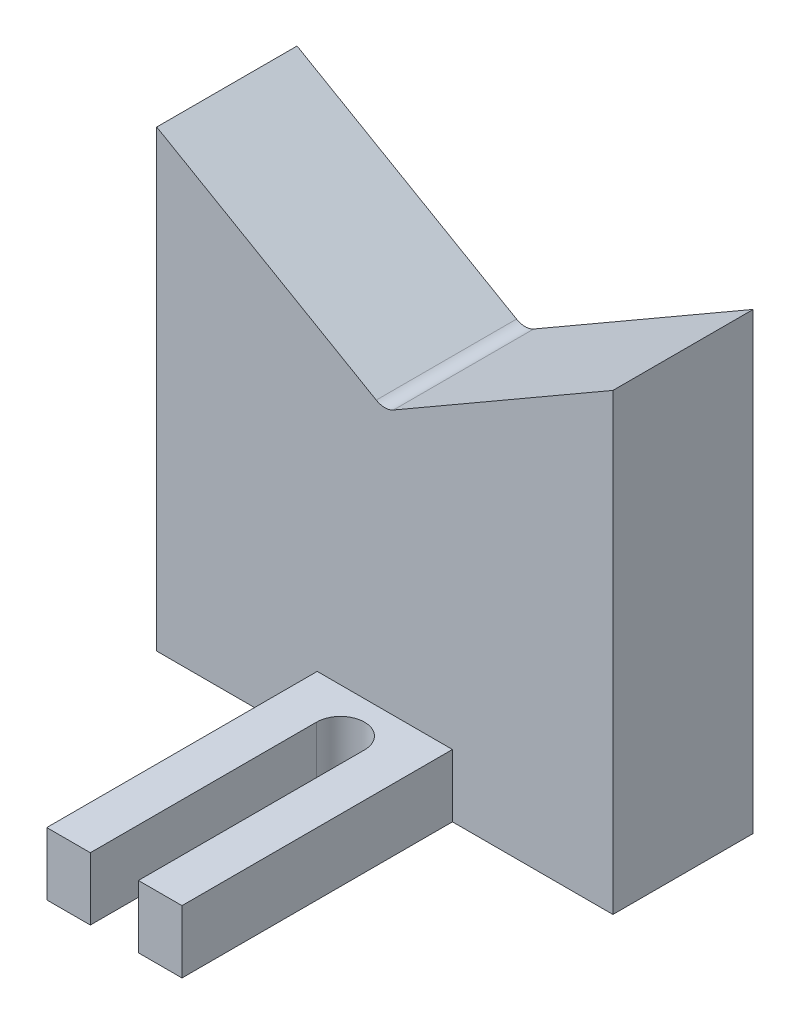
ISO-10303-21;
HEADER;
FILE_DESCRIPTION(('STEP AP214'),'2;1');
FILE_NAME('part.step','',(''),(''),'','','');
FILE_SCHEMA(('AUTOMOTIVE_DESIGN { 1 0 10303 214 1 1 1 1 }'));
ENDSEC;
DATA;
#1=APPLICATION_CONTEXT('core data for automotive mechanical design processes');
#2=APPLICATION_PROTOCOL_DEFINITION('international standard','automotive_design',2000,#1);
#3=PRODUCT_CONTEXT('',#1,'mechanical');
#4=PRODUCT('Part','Part','',(#3));
#5=PRODUCT_RELATED_PRODUCT_CATEGORY('part','',(#4));
#6=PRODUCT_DEFINITION_FORMATION('','',#4);
#7=PRODUCT_DEFINITION_CONTEXT('part definition',#1,'design');
#8=PRODUCT_DEFINITION('design','',#6,#7);
#9=PRODUCT_DEFINITION_SHAPE('','',#8);
#10=(LENGTH_UNIT() NAMED_UNIT(*) SI_UNIT(.MILLI.,.METRE.));
#11=(NAMED_UNIT(*) PLANE_ANGLE_UNIT() SI_UNIT($,.RADIAN.));
#12=(NAMED_UNIT(*) SI_UNIT($,.STERADIAN.) SOLID_ANGLE_UNIT());
#13=UNCERTAINTY_MEASURE_WITH_UNIT(LENGTH_MEASURE(1.E-05),#10,'distance_accuracy_value','');
#14=(GEOMETRIC_REPRESENTATION_CONTEXT(3) GLOBAL_UNCERTAINTY_ASSIGNED_CONTEXT((#13)) GLOBAL_UNIT_ASSIGNED_CONTEXT((#10,
#11,#12)) REPRESENTATION_CONTEXT('',''));
#15=CARTESIAN_POINT('',(0.,0.,0.));
#16=DIRECTION('',(0.,0.,1.));
#17=DIRECTION('',(1.,0.,0.));
#18=AXIS2_PLACEMENT_3D('',#15,#16,#17);
#19=CARTESIAN_POINT('',(-10.,-38.3824746458796,60.7518));
#20=DIRECTION('',(0.,0.,1.));
#21=DIRECTION('',(1.,0.,0.));
#22=AXIS2_PLACEMENT_3D('',#19,#20,#21);
#23=PLANE('',#22);
#24=DIRECTION('',(1.,0.,0.));
#25=VECTOR('',#24,1.);
#26=CARTESIAN_POINT('',(-10.,-47.6524746458796,60.7518));
#27=LINE('',#26,#25);
#28=CARTESIAN_POINT('',(-10.,-47.6524746458796,60.7518));
#29=VERTEX_POINT('',#28);
#30=CARTESIAN_POINT('',(-3.55499999999999,-47.6524746458796,60.7518));
#31=VERTEX_POINT('',#30);
#32=EDGE_CURVE('E163',#29,#31,#27,.T.);
#33=ORIENTED_EDGE('',*,*,#32,.T.);
#34=DIRECTION('',(0.,1.,0.));
#35=VECTOR('',#34,1.);
#36=CARTESIAN_POINT('',(-3.55499999999999,-48.3824746458796,60.7518));
#37=LINE('',#36,#35);
#38=CARTESIAN_POINT('',(-3.55499999999999,-38.3824746458796,60.7518));
#39=VERTEX_POINT('',#38);
#40=EDGE_CURVE('E150',#31,#39,#37,.T.);
#41=ORIENTED_EDGE('',*,*,#40,.T.);
#42=DIRECTION('',(1.,0.,0.));
#43=VECTOR('',#42,1.);
#44=CARTESIAN_POINT('',(-10.,-38.3824746458796,60.7518));
#45=LINE('',#44,#43);
#46=CARTESIAN_POINT('',(-10.,-38.3824746458796,60.7518));
#47=VERTEX_POINT('',#46);
#48=EDGE_CURVE('E156',#47,#39,#45,.T.);
#49=ORIENTED_EDGE('',*,*,#48,.F.);
#50=DIRECTION('',(0.,-1.,0.));
#51=VECTOR('',#50,1.);
#52=CARTESIAN_POINT('',(-10.,-38.3824746458796,60.7518));
#53=LINE('',#52,#51);
#54=EDGE_CURVE('E242',#47,#29,#53,.T.);
#55=ORIENTED_EDGE('',*,*,#54,.T.);
#56=EDGE_LOOP('',(#33,#41,#49,#55));
#57=FACE_BOUND('',#56,.T.);
#58=ADVANCED_FACE('F41',(#57),#23,.T.);
#59=CARTESIAN_POINT('',(-10.,-38.3824746458796,60.7518));
#60=DIRECTION('',(0.,1.,0.));
#61=DIRECTION('',(0.,0.,1.));
#62=AXIS2_PLACEMENT_3D('',#59,#60,#61);
#63=PLANE('',#62);
#64=CARTESIAN_POINT('',(0.,-38.3824746458796,27.3068));
#65=DIRECTION('',(0.,1.,0.));
#66=DIRECTION('',(0.,0.,1.));
#67=AXIS2_PLACEMENT_3D('',#64,#65,#66);
#68=CIRCLE('',#67,3.55500000000001);
#69=CARTESIAN_POINT('',(3.55500000000002,-38.3824746458796,27.3068));
#70=VERTEX_POINT('',#69);
#71=CARTESIAN_POINT('',(-3.555,-38.3824746458796,27.3068));
#72=VERTEX_POINT('',#71);
#73=EDGE_CURVE('E155',#70,#72,#68,.T.);
#74=ORIENTED_EDGE('',*,*,#73,.F.);
#75=DIRECTION('',(0.,0.,1.));
#76=VECTOR('',#75,1.);
#77=CARTESIAN_POINT('',(3.55500000000001,-38.3824746458796,60.7518));
#78=LINE('',#77,#76);
#79=CARTESIAN_POINT('',(3.55500000000001,-38.3824746458796,60.7518));
#80=VERTEX_POINT('',#79);
#81=EDGE_CURVE('E57',#70,#80,#78,.T.);
#82=ORIENTED_EDGE('',*,*,#81,.T.);
#83=CARTESIAN_POINT('',(10.,-38.3824746458796,60.7518));
#84=VERTEX_POINT('',#83);
#85=EDGE_CURVE('E169',#80,#84,#45,.T.);
#86=ORIENTED_EDGE('',*,*,#85,.T.);
#87=DIRECTION('',(0.,0.,1.));
#88=VECTOR('',#87,1.);
#89=CARTESIAN_POINT('',(10.,-38.3824746458796,60.7518));
#90=LINE('',#89,#88);
#91=CARTESIAN_POINT('',(10.,-38.3824746458796,20.7518));
#92=VERTEX_POINT('',#91);
#93=EDGE_CURVE('E247',#92,#84,#90,.T.);
#94=ORIENTED_EDGE('',*,*,#93,.F.);
#95=DIRECTION('',(1.,0.,0.));
#96=VECTOR('',#95,1.);
#97=CARTESIAN_POINT('',(-10.,-38.3824746458796,20.7518));
#98=LINE('',#97,#96);
#99=CARTESIAN_POINT('',(-10.,-38.3824746458796,20.7518));
#100=VERTEX_POINT('',#99);
#101=EDGE_CURVE('E172',#100,#92,#98,.T.);
#102=ORIENTED_EDGE('',*,*,#101,.F.);
#103=DIRECTION('',(0.,0.,1.));
#104=VECTOR('',#103,1.);
#105=CARTESIAN_POINT('',(-10.,-38.3824746458796,60.7518));
#106=LINE('',#105,#104);
#107=EDGE_CURVE('E170',#100,#47,#106,.T.);
#108=ORIENTED_EDGE('',*,*,#107,.T.);
#109=ORIENTED_EDGE('',*,*,#48,.T.);
#110=DIRECTION('',(0.,0.,1.));
#111=VECTOR('',#110,1.);
#112=CARTESIAN_POINT('',(-3.55499999999999,-38.3824746458796,60.7518));
#113=LINE('',#112,#111);
#114=EDGE_CURVE('E144',#72,#39,#113,.T.);
#115=ORIENTED_EDGE('',*,*,#114,.F.);
#116=EDGE_LOOP('',(#74,#82,#86,#94,#102,#108,#109,#115));
#117=FACE_BOUND('',#116,.T.);
#118=ADVANCED_FACE('F164',(#117),#63,.T.);
#119=CARTESIAN_POINT('',(0.,0.,20.7518));
#120=DIRECTION('',(0.,0.,-1.));
#121=DIRECTION('',(-1.,0.,0.));
#122=AXIS2_PLACEMENT_3D('',#119,#120,#121);
#123=PLANE('',#122);
#124=DIRECTION('',(0.,1.,0.));
#125=VECTOR('',#124,1.);
#126=CARTESIAN_POINT('',(10.,-38.3824746458796,20.7518));
#127=LINE('',#126,#125);
#128=CARTESIAN_POINT('',(10.,-47.6524746458796,20.7518));
#129=VERTEX_POINT('',#128);
#130=EDGE_CURVE('E252',#129,#92,#127,.T.);
#131=ORIENTED_EDGE('',*,*,#130,.F.);
#132=DIRECTION('',(1.,0.,0.));
#133=VECTOR('',#132,1.);
#134=CARTESIAN_POINT('',(-33.735,-47.6524746458796,20.7518));
#135=LINE('',#134,#133);
#136=CARTESIAN_POINT('',(33.735,-47.6524746458796,20.7518));
#137=VERTEX_POINT('',#136);
#138=EDGE_CURVE('E184',#129,#137,#135,.T.);
#139=ORIENTED_EDGE('',*,*,#138,.T.);
#140=DIRECTION('',(0.,1.,0.));
#141=VECTOR('',#140,1.);
#142=CARTESIAN_POINT('',(33.735,-47.6524746458796,20.7518));
#143=LINE('',#142,#141);
#144=CARTESIAN_POINT('',(33.735,19.4769113311123,20.7518));
#145=VERTEX_POINT('',#144);
#146=EDGE_CURVE('E188',#137,#145,#143,.T.);
#147=ORIENTED_EDGE('',*,*,#146,.T.);
#148=DIRECTION('',(-0.866025403784436,-0.500000000000005,0.));
#149=VECTOR('',#148,1.);
#150=CARTESIAN_POINT('',(33.735,19.4769113311123,20.7518));
#151=LINE('',#150,#149);
#152=CARTESIAN_POINT('',(1.27,0.733234841870833,20.7518));
#153=VERTEX_POINT('',#152);
#154=EDGE_CURVE('E195',#145,#153,#151,.T.);
#155=ORIENTED_EDGE('',*,*,#154,.T.);
#156=CARTESIAN_POINT('',(0.,2.93293936748331,20.7518));
#157=DIRECTION('',(0.,0.,-1.));
#158=DIRECTION('',(-1.,0.,0.));
#159=AXIS2_PLACEMENT_3D('',#156,#157,#158);
#160=CIRCLE('',#159,2.54);
#161=CARTESIAN_POINT('',(-1.27000000000001,0.73323484187084,20.7518));
#162=VERTEX_POINT('',#161);
#163=EDGE_CURVE('E216',#153,#162,#160,.T.);
#164=ORIENTED_EDGE('',*,*,#163,.T.);
#165=DIRECTION('',(-0.866025403784436,0.500000000000004,0.));
#166=VECTOR('',#165,1.);
#167=CARTESIAN_POINT('',(-33.735,19.4769113311123,20.7518));
#168=LINE('',#167,#166);
#169=CARTESIAN_POINT('',(-33.735,19.4769113311123,20.7518));
#170=VERTEX_POINT('',#169);
#171=EDGE_CURVE('E193',#162,#170,#168,.T.);
#172=ORIENTED_EDGE('',*,*,#171,.T.);
#173=DIRECTION('',(0.,-1.,0.));
#174=VECTOR('',#173,1.);
#175=CARTESIAN_POINT('',(-33.735,-47.6524746458796,20.7518));
#176=LINE('',#175,#174);
#177=CARTESIAN_POINT('',(-33.735,-47.6524746458796,20.7518));
#178=VERTEX_POINT('',#177);
#179=EDGE_CURVE('E185',#170,#178,#176,.T.);
#180=ORIENTED_EDGE('',*,*,#179,.T.);
#181=CARTESIAN_POINT('',(-10.,-47.6524746458796,20.7518));
#182=VERTEX_POINT('',#181);
#183=EDGE_CURVE('E190',#178,#182,#135,.T.);
#184=ORIENTED_EDGE('',*,*,#183,.T.);
#185=DIRECTION('',(0.,1.,0.));
#186=VECTOR('',#185,1.);
#187=CARTESIAN_POINT('',(-10.,-38.3824746458796,20.7518));
#188=LINE('',#187,#186);
#189=EDGE_CURVE('E237',#182,#100,#188,.T.);
#190=ORIENTED_EDGE('',*,*,#189,.T.);
#191=ORIENTED_EDGE('',*,*,#101,.T.);
#192=EDGE_LOOP('',(#131,#139,#147,#155,#164,#172,#180,#184,#190,#191));
#193=FACE_BOUND('',#192,.T.);
#194=ADVANCED_FACE('F267',(#193),#123,.F.);
#195=CARTESIAN_POINT('',(-33.735,-47.6524746458796,20.7518));
#196=DIRECTION('',(1.,0.,0.));
#197=DIRECTION('',(0.,0.,-1.));
#198=AXIS2_PLACEMENT_3D('',#195,#196,#197);
#199=PLANE('',#198);
#200=DIRECTION('',(0.,-1.,0.));
#201=VECTOR('',#200,1.);
#202=CARTESIAN_POINT('',(-33.735,-47.6524746458796,0.));
#203=LINE('',#202,#201);
#204=CARTESIAN_POINT('',(-33.735,19.4769113311123,0.));
#205=VERTEX_POINT('',#204);
#206=CARTESIAN_POINT('',(-33.735,-47.6524746458796,0.));
#207=VERTEX_POINT('',#206);
#208=EDGE_CURVE('E166',#205,#207,#203,.T.);
#209=ORIENTED_EDGE('',*,*,#208,.T.);
#210=DIRECTION('',(0.,0.,-1.));
#211=VECTOR('',#210,1.);
#212=CARTESIAN_POINT('',(-33.735,-47.6524746458796,20.7518));
#213=LINE('',#212,#211);
#214=EDGE_CURVE('E211',#178,#207,#213,.T.);
#215=ORIENTED_EDGE('',*,*,#214,.F.);
#216=ORIENTED_EDGE('',*,*,#179,.F.);
#217=DIRECTION('',(0.,0.,-1.));
#218=VECTOR('',#217,1.);
#219=CARTESIAN_POINT('',(-33.735,19.4769113311123,20.7518));
#220=LINE('',#219,#218);
#221=EDGE_CURVE('E194',#170,#205,#220,.T.);
#222=ORIENTED_EDGE('',*,*,#221,.T.);
#223=EDGE_LOOP('',(#209,#215,#216,#222));
#224=FACE_BOUND('',#223,.T.);
#225=ADVANCED_FACE('F290',(#224),#199,.F.);
#226=CARTESIAN_POINT('',(-33.735,-47.6524746458796,20.7518));
#227=DIRECTION('',(0.,1.,0.));
#228=DIRECTION('',(0.,0.,1.));
#229=AXIS2_PLACEMENT_3D('',#226,#227,#228);
#230=PLANE('',#229);
#231=CARTESIAN_POINT('',(0.,-47.6524746458796,27.3068));
#232=DIRECTION('',(0.,1.,0.));
#233=DIRECTION('',(0.,0.,1.));
#234=AXIS2_PLACEMENT_3D('',#231,#232,#233);
#235=CIRCLE('',#234,3.55500000000001);
#236=CARTESIAN_POINT('',(3.55500000000001,-47.6524746458796,27.3068));
#237=VERTEX_POINT('',#236);
#238=CARTESIAN_POINT('',(-3.555,-47.6524746458796,27.3068));
#239=VERTEX_POINT('',#238);
#240=EDGE_CURVE('E162',#237,#239,#235,.T.);
#241=ORIENTED_EDGE('',*,*,#240,.T.);
#242=DIRECTION('',(0.,0.,1.));
#243=VECTOR('',#242,1.);
#244=CARTESIAN_POINT('',(-3.555,-47.6524746458796,20.7518));
#245=LINE('',#244,#243);
#246=EDGE_CURVE('E11',#239,#31,#245,.T.);
#247=ORIENTED_EDGE('',*,*,#246,.T.);
#248=ORIENTED_EDGE('',*,*,#32,.F.);
#249=DIRECTION('',(0.,0.,-1.));
#250=VECTOR('',#249,1.);
#251=CARTESIAN_POINT('',(-10.,-47.6524746458796,60.7518));
#252=LINE('',#251,#250);
#253=EDGE_CURVE('E241',#29,#182,#252,.T.);
#254=ORIENTED_EDGE('',*,*,#253,.T.);
#255=ORIENTED_EDGE('',*,*,#183,.F.);
#256=ORIENTED_EDGE('',*,*,#214,.T.);
#257=DIRECTION('',(1.,0.,0.));
#258=VECTOR('',#257,1.);
#259=CARTESIAN_POINT('',(-33.735,-47.6524746458796,0.));
#260=LINE('',#259,#258);
#261=CARTESIAN_POINT('',(33.735,-47.6524746458796,0.));
#262=VERTEX_POINT('',#261);
#263=EDGE_CURVE('E175',#207,#262,#260,.T.);
#264=ORIENTED_EDGE('',*,*,#263,.T.);
#265=DIRECTION('',(0.,0.,-1.));
#266=VECTOR('',#265,1.);
#267=CARTESIAN_POINT('',(33.735,-47.6524746458796,20.7518));
#268=LINE('',#267,#266);
#269=EDGE_CURVE('E206',#137,#262,#268,.T.);
#270=ORIENTED_EDGE('',*,*,#269,.F.);
#271=ORIENTED_EDGE('',*,*,#138,.F.);
#272=DIRECTION('',(0.,0.,-1.));
#273=VECTOR('',#272,1.);
#274=CARTESIAN_POINT('',(10.,-47.6524746458796,60.7518));
#275=LINE('',#274,#273);
#276=CARTESIAN_POINT('',(10.,-47.6524746458796,60.7518));
#277=VERTEX_POINT('',#276);
#278=EDGE_CURVE('E240',#277,#129,#275,.T.);
#279=ORIENTED_EDGE('',*,*,#278,.F.);
#280=CARTESIAN_POINT('',(3.55500000000001,-47.6524746458796,60.7518));
#281=VERTEX_POINT('',#280);
#282=EDGE_CURVE('E181',#281,#277,#27,.T.);
#283=ORIENTED_EDGE('',*,*,#282,.F.);
#284=DIRECTION('',(0.,0.,1.));
#285=VECTOR('',#284,1.);
#286=CARTESIAN_POINT('',(3.555,-47.6524746458796,20.7518));
#287=LINE('',#286,#285);
#288=EDGE_CURVE('E47',#237,#281,#287,.T.);
#289=ORIENTED_EDGE('',*,*,#288,.F.);
#290=EDGE_LOOP('',(#241,#247,#248,#254,#255,#256,#264,#270,#271,#279,#283,#289));
#291=FACE_BOUND('',#290,.T.);
#292=ADVANCED_FACE('F232',(#291),#230,.F.);
#293=CARTESIAN_POINT('',(33.735,-47.6524746458796,20.7518));
#294=DIRECTION('',(-1.,0.,0.));
#295=DIRECTION('',(0.,-1.,0.));
#296=AXIS2_PLACEMENT_3D('',#293,#294,#295);
#297=PLANE('',#296);
#298=DIRECTION('',(0.,1.,0.));
#299=VECTOR('',#298,1.);
#300=CARTESIAN_POINT('',(33.735,-47.6524746458796,0.));
#301=LINE('',#300,#299);
#302=CARTESIAN_POINT('',(33.735,19.4769113311123,0.));
#303=VERTEX_POINT('',#302);
#304=EDGE_CURVE('E197',#262,#303,#301,.T.);
#305=ORIENTED_EDGE('',*,*,#304,.T.);
#306=DIRECTION('',(0.,0.,-1.));
#307=VECTOR('',#306,1.);
#308=CARTESIAN_POINT('',(33.735,19.4769113311123,20.7518));
#309=LINE('',#308,#307);
#310=EDGE_CURVE('E203',#145,#303,#309,.T.);
#311=ORIENTED_EDGE('',*,*,#310,.F.);
#312=ORIENTED_EDGE('',*,*,#146,.F.);
#313=ORIENTED_EDGE('',*,*,#269,.T.);
#314=EDGE_LOOP('',(#305,#311,#312,#313));
#315=FACE_BOUND('',#314,.T.);
#316=ADVANCED_FACE('F275',(#315),#297,.F.);
#317=CARTESIAN_POINT('',(33.735,19.4769113311123,20.7518));
#318=DIRECTION('',(0.500000000000004,-0.866025403784436,0.));
#319=DIRECTION('',(0.866025403784436,0.500000000000004,0.));
#320=AXIS2_PLACEMENT_3D('',#317,#318,#319);
#321=PLANE('',#320);
#322=DIRECTION('',(-0.866025403784436,-0.500000000000005,0.));
#323=VECTOR('',#322,1.);
#324=CARTESIAN_POINT('',(33.735,19.4769113311123,0.));
#325=LINE('',#324,#323);
#326=CARTESIAN_POINT('',(1.27,0.733234841870833,0.));
#327=VERTEX_POINT('',#326);
#328=EDGE_CURVE('E196',#303,#327,#325,.T.);
#329=ORIENTED_EDGE('',*,*,#328,.T.);
#330=DIRECTION('',(0.,0.,-1.));
#331=VECTOR('',#330,1.);
#332=CARTESIAN_POINT('',(1.27000000000001,0.73323484187084,20.7518));
#333=LINE('',#332,#331);
#334=EDGE_CURVE('E63',#327,#153,#333,.F.);
#335=ORIENTED_EDGE('',*,*,#334,.T.);
#336=ORIENTED_EDGE('',*,*,#154,.F.);
#337=ORIENTED_EDGE('',*,*,#310,.T.);
#338=EDGE_LOOP('',(#329,#335,#336,#337));
#339=FACE_BOUND('',#338,.T.);
#340=ADVANCED_FACE('F313',(#339),#321,.F.);
#341=CARTESIAN_POINT('',(-33.735,19.4769113311123,20.7518));
#342=DIRECTION('',(-0.500000000000004,-0.866025403784436,0.));
#343=DIRECTION('',(0.866025403784436,-0.500000000000004,0.));
#344=AXIS2_PLACEMENT_3D('',#341,#342,#343);
#345=PLANE('',#344);
#346=ORIENTED_EDGE('',*,*,#171,.F.);
#347=DIRECTION('',(0.,0.,-1.));
#348=VECTOR('',#347,1.);
#349=CARTESIAN_POINT('',(-1.27000000000001,0.733234841870837,0.));
#350=LINE('',#349,#348);
#351=CARTESIAN_POINT('',(-1.27000000000001,0.73323484187084,0.));
#352=VERTEX_POINT('',#351);
#353=EDGE_CURVE('E213',#162,#352,#350,.T.);
#354=ORIENTED_EDGE('',*,*,#353,.T.);
#355=DIRECTION('',(-0.866025403784436,0.500000000000004,0.));
#356=VECTOR('',#355,1.);
#357=CARTESIAN_POINT('',(-33.735,19.4769113311123,0.));
#358=LINE('',#357,#356);
#359=EDGE_CURVE('E187',#352,#205,#358,.T.);
#360=ORIENTED_EDGE('',*,*,#359,.T.);
#361=ORIENTED_EDGE('',*,*,#221,.F.);
#362=EDGE_LOOP('',(#346,#354,#360,#361));
#363=FACE_BOUND('',#362,.T.);
#364=ADVANCED_FACE('F278',(#363),#345,.F.);
#365=CARTESIAN_POINT('',(0.,0.,0.));
#366=DIRECTION('',(0.,0.,-1.));
#367=DIRECTION('',(-1.,0.,0.));
#368=AXIS2_PLACEMENT_3D('',#365,#366,#367);
#369=PLANE('',#368);
#370=ORIENTED_EDGE('',*,*,#208,.F.);
#371=ORIENTED_EDGE('',*,*,#359,.F.);
#372=CARTESIAN_POINT('',(0.,2.93293936748331,0.));
#373=DIRECTION('',(0.,0.,-1.));
#374=DIRECTION('',(-1.,0.,0.));
#375=AXIS2_PLACEMENT_3D('',#372,#373,#374);
#376=CIRCLE('',#375,2.54);
#377=EDGE_CURVE('E217',#352,#327,#376,.F.);
#378=ORIENTED_EDGE('',*,*,#377,.T.);
#379=ORIENTED_EDGE('',*,*,#328,.F.);
#380=ORIENTED_EDGE('',*,*,#304,.F.);
#381=ORIENTED_EDGE('',*,*,#263,.F.);
#382=EDGE_LOOP('',(#370,#371,#378,#379,#380,#381));
#383=FACE_BOUND('',#382,.T.);
#384=ADVANCED_FACE('F282',(#383),#369,.T.);
#385=DIRECTION('',(0.,1.,0.));
#386=VECTOR('',#385,1.);
#387=CARTESIAN_POINT('',(3.55500000000001,-48.3824746458796,60.7518));
#388=LINE('',#387,#386);
#389=EDGE_CURVE('E221',#281,#80,#388,.T.);
#390=ORIENTED_EDGE('',*,*,#389,.F.);
#391=ORIENTED_EDGE('',*,*,#282,.T.);
#392=DIRECTION('',(0.,-1.,0.));
#393=VECTOR('',#392,1.);
#394=CARTESIAN_POINT('',(10.,-38.3824746458796,60.7518));
#395=LINE('',#394,#393);
#396=EDGE_CURVE('E251',#84,#277,#395,.T.);
#397=ORIENTED_EDGE('',*,*,#396,.F.);
#398=ORIENTED_EDGE('',*,*,#85,.F.);
#399=EDGE_LOOP('',(#390,#391,#397,#398));
#400=FACE_BOUND('',#399,.T.);
#401=ADVANCED_FACE('F233',(#400),#23,.T.);
#402=CARTESIAN_POINT('',(-10.,0.,0.));
#403=DIRECTION('',(1.,0.,0.));
#404=DIRECTION('',(0.,0.,-1.));
#405=AXIS2_PLACEMENT_3D('',#402,#403,#404);
#406=PLANE('',#405);
#407=ORIENTED_EDGE('',*,*,#54,.F.);
#408=ORIENTED_EDGE('',*,*,#107,.F.);
#409=ORIENTED_EDGE('',*,*,#189,.F.);
#410=ORIENTED_EDGE('',*,*,#253,.F.);
#411=EDGE_LOOP('',(#407,#408,#409,#410));
#412=FACE_BOUND('',#411,.T.);
#413=ADVANCED_FACE('F293',(#412),#406,.F.);
#414=CARTESIAN_POINT('',(10.,0.,0.));
#415=DIRECTION('',(1.,0.,0.));
#416=DIRECTION('',(0.,0.,-1.));
#417=AXIS2_PLACEMENT_3D('',#414,#415,#416);
#418=PLANE('',#417);
#419=ORIENTED_EDGE('',*,*,#396,.T.);
#420=ORIENTED_EDGE('',*,*,#278,.T.);
#421=ORIENTED_EDGE('',*,*,#130,.T.);
#422=ORIENTED_EDGE('',*,*,#93,.T.);
#423=EDGE_LOOP('',(#419,#420,#421,#422));
#424=FACE_BOUND('',#423,.T.);
#425=ADVANCED_FACE('F265',(#424),#418,.T.);
#426=CARTESIAN_POINT('',(0.,2.93293936748331,20.7518));
#427=DIRECTION('',(0.,0.,1.));
#428=DIRECTION('',(1.,0.,0.));
#429=AXIS2_PLACEMENT_3D('',#426,#427,#428);
#430=CYLINDRICAL_SURFACE('',#429,2.54);
#431=ORIENTED_EDGE('',*,*,#163,.F.);
#432=ORIENTED_EDGE('',*,*,#334,.F.);
#433=ORIENTED_EDGE('',*,*,#377,.F.);
#434=ORIENTED_EDGE('',*,*,#353,.F.);
#435=EDGE_LOOP('',(#431,#432,#433,#434));
#436=FACE_BOUND('',#435,.T.);
#437=ADVANCED_FACE('F43',(#436),#430,.F.);
#438=CARTESIAN_POINT('',(-3.55499999999999,-48.3824746458796,60.7518));
#439=DIRECTION('',(-1.,0.,0.));
#440=DIRECTION('',(0.,0.,1.));
#441=AXIS2_PLACEMENT_3D('',#438,#439,#440);
#442=PLANE('',#441);
#443=DIRECTION('',(0.,1.,0.));
#444=VECTOR('',#443,1.);
#445=CARTESIAN_POINT('',(-3.555,-48.3824746458796,27.3068));
#446=LINE('',#445,#444);
#447=EDGE_CURVE('E148',#239,#72,#446,.T.);
#448=ORIENTED_EDGE('',*,*,#447,.T.);
#449=ORIENTED_EDGE('',*,*,#114,.T.);
#450=ORIENTED_EDGE('',*,*,#40,.F.);
#451=ORIENTED_EDGE('',*,*,#246,.F.);
#452=EDGE_LOOP('',(#448,#449,#450,#451));
#453=FACE_BOUND('',#452,.T.);
#454=ADVANCED_FACE('F146',(#453),#442,.F.);
#455=CARTESIAN_POINT('',(3.55500000000001,-48.3824746458796,60.7518));
#456=DIRECTION('',(-1.,0.,0.));
#457=DIRECTION('',(0.,0.,1.));
#458=AXIS2_PLACEMENT_3D('',#455,#456,#457);
#459=PLANE('',#458);
#460=ORIENTED_EDGE('',*,*,#288,.T.);
#461=ORIENTED_EDGE('',*,*,#389,.T.);
#462=ORIENTED_EDGE('',*,*,#81,.F.);
#463=DIRECTION('',(0.,1.,0.));
#464=VECTOR('',#463,1.);
#465=CARTESIAN_POINT('',(3.55500000000001,-48.3824746458796,27.3068));
#466=LINE('',#465,#464);
#467=EDGE_CURVE('E223',#237,#70,#466,.T.);
#468=ORIENTED_EDGE('',*,*,#467,.F.);
#469=EDGE_LOOP('',(#460,#461,#462,#468));
#470=FACE_BOUND('',#469,.T.);
#471=ADVANCED_FACE('F224',(#470),#459,.T.);
#472=CARTESIAN_POINT('',(0.,-48.3824746458796,27.3068));
#473=DIRECTION('',(0.,1.,0.));
#474=DIRECTION('',(0.,0.,1.));
#475=AXIS2_PLACEMENT_3D('',#472,#473,#474);
#476=CYLINDRICAL_SURFACE('',#475,3.55500000000001);
#477=ORIENTED_EDGE('',*,*,#467,.T.);
#478=ORIENTED_EDGE('',*,*,#73,.T.);
#479=ORIENTED_EDGE('',*,*,#447,.F.);
#480=ORIENTED_EDGE('',*,*,#240,.F.);
#481=EDGE_LOOP('',(#477,#478,#479,#480));
#482=FACE_BOUND('',#481,.T.);
#483=ADVANCED_FACE('F263',(#482),#476,.F.);
#484=CLOSED_SHELL('',(#58,#118,#194,#225,#292,#316,#340,#364,#384,#401,#413,#425,#437,#454,#471,#483));
#485=MANIFOLD_SOLID_BREP('B2',#484);
#486=ADVANCED_BREP_SHAPE_REPRESENTATION('',(#18,#485),#14);
#487=SHAPE_DEFINITION_REPRESENTATION(#9,#486);
ENDSEC;
END-ISO-10303-21;
